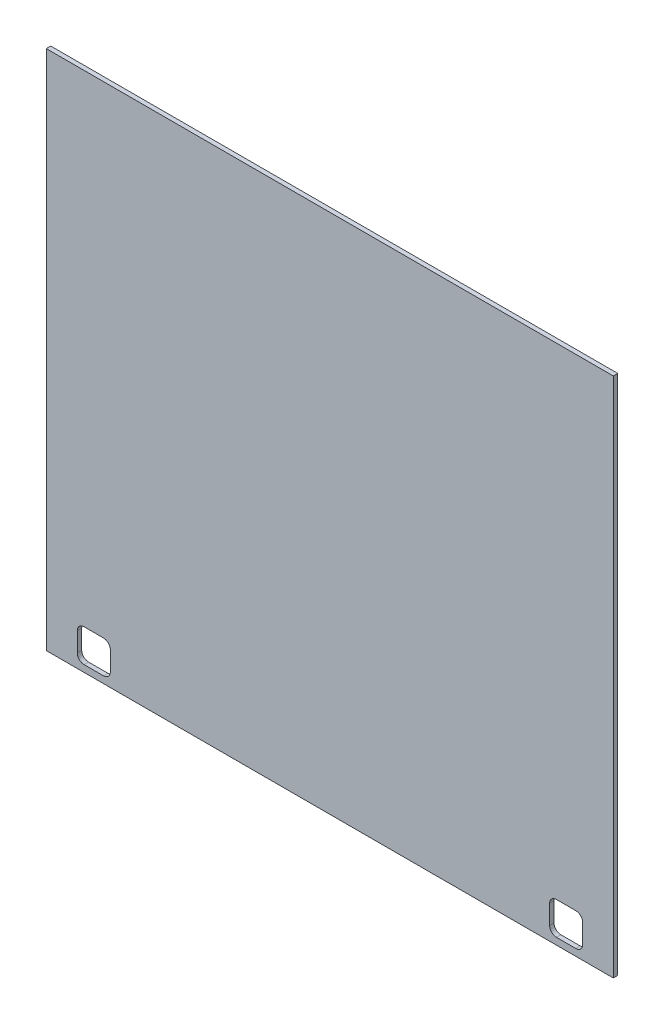
ISO-10303-21;
HEADER;
FILE_DESCRIPTION(('STEP AP214'),'2;1');
FILE_NAME('part.step','',(''),(''),'','','');
FILE_SCHEMA(('AUTOMOTIVE_DESIGN { 1 0 10303 214 1 1 1 1 }'));
ENDSEC;
DATA;
#1=APPLICATION_CONTEXT('core data for automotive mechanical design processes');
#2=APPLICATION_PROTOCOL_DEFINITION('international standard','automotive_design',2000,#1);
#3=PRODUCT_CONTEXT('',#1,'mechanical');
#4=PRODUCT('Part','Part','',(#3));
#5=PRODUCT_RELATED_PRODUCT_CATEGORY('part','',(#4));
#6=PRODUCT_DEFINITION_FORMATION('','',#4);
#7=PRODUCT_DEFINITION_CONTEXT('part definition',#1,'design');
#8=PRODUCT_DEFINITION('design','',#6,#7);
#9=PRODUCT_DEFINITION_SHAPE('','',#8);
#10=(LENGTH_UNIT() NAMED_UNIT(*) SI_UNIT(.MILLI.,.METRE.));
#11=(NAMED_UNIT(*) PLANE_ANGLE_UNIT() SI_UNIT($,.RADIAN.));
#12=(NAMED_UNIT(*) SI_UNIT($,.STERADIAN.) SOLID_ANGLE_UNIT());
#13=UNCERTAINTY_MEASURE_WITH_UNIT(LENGTH_MEASURE(1.E-05),#10,'distance_accuracy_value','');
#14=(GEOMETRIC_REPRESENTATION_CONTEXT(3) GLOBAL_UNCERTAINTY_ASSIGNED_CONTEXT((#13)) GLOBAL_UNIT_ASSIGNED_CONTEXT((#10,
#11,#12)) REPRESENTATION_CONTEXT('',''));
#15=CARTESIAN_POINT('',(0.,0.,0.));
#16=DIRECTION('',(0.,0.,1.));
#17=DIRECTION('',(1.,0.,0.));
#18=AXIS2_PLACEMENT_3D('',#15,#16,#17);
#19=CARTESIAN_POINT('',(416.,-382.5,6.5));
#20=DIRECTION('',(-1.,0.,0.));
#21=DIRECTION('',(0.,0.,1.));
#22=AXIS2_PLACEMENT_3D('',#19,#20,#21);
#23=PLANE('',#22);
#24=DIRECTION('',(0.,1.,0.));
#25=VECTOR('',#24,1.);
#26=CARTESIAN_POINT('',(416.,-382.5,0.));
#27=LINE('',#26,#25);
#28=CARTESIAN_POINT('',(416.,-382.5,0.));
#29=VERTEX_POINT('',#28);
#30=CARTESIAN_POINT('',(416.,382.5,0.));
#31=VERTEX_POINT('',#30);
#32=EDGE_CURVE('E287',#29,#31,#27,.T.);
#33=ORIENTED_EDGE('',*,*,#32,.T.);
#34=DIRECTION('',(0.,0.,-1.));
#35=VECTOR('',#34,1.);
#36=CARTESIAN_POINT('',(416.,382.5,6.5));
#37=LINE('',#36,#35);
#38=CARTESIAN_POINT('',(416.,382.5,6.5));
#39=VERTEX_POINT('',#38);
#40=EDGE_CURVE('E11',#39,#31,#37,.T.);
#41=ORIENTED_EDGE('',*,*,#40,.F.);
#42=DIRECTION('',(0.,1.,0.));
#43=VECTOR('',#42,1.);
#44=CARTESIAN_POINT('',(416.,-382.5,6.5));
#45=LINE('',#44,#43);
#46=CARTESIAN_POINT('',(416.,-382.5,6.5));
#47=VERTEX_POINT('',#46);
#48=EDGE_CURVE('E302',#47,#39,#45,.T.);
#49=ORIENTED_EDGE('',*,*,#48,.F.);
#50=DIRECTION('',(0.,0.,-1.));
#51=VECTOR('',#50,1.);
#52=CARTESIAN_POINT('',(416.,-382.5,6.5));
#53=LINE('',#52,#51);
#54=EDGE_CURVE('E312',#47,#29,#53,.T.);
#55=ORIENTED_EDGE('',*,*,#54,.T.);
#56=EDGE_LOOP('',(#33,#41,#49,#55));
#57=FACE_BOUND('',#56,.T.);
#58=ADVANCED_FACE('F33',(#57),#23,.F.);
#59=CARTESIAN_POINT('',(-416.,382.5,6.5));
#60=DIRECTION('',(0.,-1.,0.));
#61=DIRECTION('',(0.,0.,-1.));
#62=AXIS2_PLACEMENT_3D('',#59,#60,#61);
#63=PLANE('',#62);
#64=DIRECTION('',(-1.,0.,0.));
#65=VECTOR('',#64,1.);
#66=CARTESIAN_POINT('',(-416.,382.5,0.));
#67=LINE('',#66,#65);
#68=CARTESIAN_POINT('',(-416.,382.5,0.));
#69=VERTEX_POINT('',#68);
#70=EDGE_CURVE('E315',#31,#69,#67,.T.);
#71=ORIENTED_EDGE('',*,*,#70,.T.);
#72=DIRECTION('',(0.,0.,-1.));
#73=VECTOR('',#72,1.);
#74=CARTESIAN_POINT('',(-416.,382.5,6.5));
#75=LINE('',#74,#73);
#76=CARTESIAN_POINT('',(-416.,382.5,6.5));
#77=VERTEX_POINT('',#76);
#78=EDGE_CURVE('E40',#77,#69,#75,.T.);
#79=ORIENTED_EDGE('',*,*,#78,.F.);
#80=DIRECTION('',(-1.,0.,0.));
#81=VECTOR('',#80,1.);
#82=CARTESIAN_POINT('',(-416.,382.5,6.5));
#83=LINE('',#82,#81);
#84=EDGE_CURVE('E305',#39,#77,#83,.T.);
#85=ORIENTED_EDGE('',*,*,#84,.F.);
#86=ORIENTED_EDGE('',*,*,#40,.T.);
#87=EDGE_LOOP('',(#71,#79,#85,#86));
#88=FACE_BOUND('',#87,.T.);
#89=ADVANCED_FACE('F344',(#88),#63,.F.);
#90=CARTESIAN_POINT('',(-416.,-382.5,6.5));
#91=DIRECTION('',(1.,0.,0.));
#92=DIRECTION('',(0.,0.,-1.));
#93=AXIS2_PLACEMENT_3D('',#90,#91,#92);
#94=PLANE('',#93);
#95=DIRECTION('',(0.,-1.,0.));
#96=VECTOR('',#95,1.);
#97=CARTESIAN_POINT('',(-416.,-382.5,0.));
#98=LINE('',#97,#96);
#99=CARTESIAN_POINT('',(-416.,-382.5,0.));
#100=VERTEX_POINT('',#99);
#101=EDGE_CURVE('E317',#69,#100,#98,.T.);
#102=ORIENTED_EDGE('',*,*,#101,.T.);
#103=DIRECTION('',(0.,0.,-1.));
#104=VECTOR('',#103,1.);
#105=CARTESIAN_POINT('',(-416.,-382.5,6.5));
#106=LINE('',#105,#104);
#107=CARTESIAN_POINT('',(-416.,-382.5,6.5));
#108=VERTEX_POINT('',#107);
#109=EDGE_CURVE('E322',#108,#100,#106,.T.);
#110=ORIENTED_EDGE('',*,*,#109,.F.);
#111=DIRECTION('',(0.,-1.,0.));
#112=VECTOR('',#111,1.);
#113=CARTESIAN_POINT('',(-416.,-382.5,6.5));
#114=LINE('',#113,#112);
#115=EDGE_CURVE('E308',#77,#108,#114,.T.);
#116=ORIENTED_EDGE('',*,*,#115,.F.);
#117=ORIENTED_EDGE('',*,*,#78,.T.);
#118=EDGE_LOOP('',(#102,#110,#116,#117));
#119=FACE_BOUND('',#118,.T.);
#120=ADVANCED_FACE('F329',(#119),#94,.F.);
#121=CARTESIAN_POINT('',(-416.,-382.5,6.5));
#122=DIRECTION('',(0.,1.,0.));
#123=DIRECTION('',(0.,0.,1.));
#124=AXIS2_PLACEMENT_3D('',#121,#122,#123);
#125=PLANE('',#124);
#126=DIRECTION('',(1.,0.,0.));
#127=VECTOR('',#126,1.);
#128=CARTESIAN_POINT('',(-416.,-382.5,0.));
#129=LINE('',#128,#127);
#130=EDGE_CURVE('E306',#100,#29,#129,.T.);
#131=ORIENTED_EDGE('',*,*,#130,.T.);
#132=ORIENTED_EDGE('',*,*,#54,.F.);
#133=DIRECTION('',(1.,0.,0.));
#134=VECTOR('',#133,1.);
#135=CARTESIAN_POINT('',(-416.,-382.5,6.5));
#136=LINE('',#135,#134);
#137=EDGE_CURVE('E310',#108,#47,#136,.T.);
#138=ORIENTED_EDGE('',*,*,#137,.F.);
#139=ORIENTED_EDGE('',*,*,#109,.T.);
#140=EDGE_LOOP('',(#131,#132,#138,#139));
#141=FACE_BOUND('',#140,.T.);
#142=ADVANCED_FACE('F338',(#141),#125,.F.);
#143=CARTESIAN_POINT('',(0.,0.,6.5));
#144=DIRECTION('',(0.,0.,-1.));
#145=DIRECTION('',(-1.,0.,0.));
#146=AXIS2_PLACEMENT_3D('',#143,#144,#145);
#147=PLANE('',#146);
#148=DIRECTION('',(-1.,0.,0.));
#149=VECTOR('',#148,1.);
#150=CARTESIAN_POINT('',(-332.,-372.521350196704,6.5));
#151=LINE('',#150,#149);
#152=CARTESIAN_POINT('',(-332.,-372.521350196704,6.5));
#153=VERTEX_POINT('',#152);
#154=CARTESIAN_POINT('',(-360.473976839619,-372.521350196704,6.5));
#155=VERTEX_POINT('',#154);
#156=EDGE_CURVE('E177',#153,#155,#151,.T.);
#157=ORIENTED_EDGE('',*,*,#156,.T.);
#158=CARTESIAN_POINT('',(-360.473976839619,-362.521350196704,6.5));
#159=DIRECTION('',(0.,0.,-1.));
#160=DIRECTION('',(1.,0.,0.));
#161=AXIS2_PLACEMENT_3D('',#158,#159,#160);
#162=CIRCLE('',#161,10.);
#163=CARTESIAN_POINT('',(-370.473976839619,-362.521350196704,6.5));
#164=VERTEX_POINT('',#163);
#165=EDGE_CURVE('E171',#155,#164,#162,.T.);
#166=ORIENTED_EDGE('',*,*,#165,.T.);
#167=DIRECTION('',(0.,1.,0.));
#168=VECTOR('',#167,1.);
#169=CARTESIAN_POINT('',(-370.473976839619,-362.521350196704,6.5));
#170=LINE('',#169,#168);
#171=CARTESIAN_POINT('',(-370.473976839619,-334.475228476118,6.5));
#172=VERTEX_POINT('',#171);
#173=EDGE_CURVE('E180',#164,#172,#170,.T.);
#174=ORIENTED_EDGE('',*,*,#173,.T.);
#175=CARTESIAN_POINT('',(-360.473976839619,-334.475228476118,6.5));
#176=DIRECTION('',(0.,0.,-1.));
#177=DIRECTION('',(-1.,0.,0.));
#178=AXIS2_PLACEMENT_3D('',#175,#176,#177);
#179=CIRCLE('',#178,9.99999999999998);
#180=CARTESIAN_POINT('',(-360.473976839619,-324.475228476118,6.5));
#181=VERTEX_POINT('',#180);
#182=EDGE_CURVE('E47',#172,#181,#179,.T.);
#183=ORIENTED_EDGE('',*,*,#182,.T.);
#184=DIRECTION('',(1.,0.,0.));
#185=VECTOR('',#184,1.);
#186=CARTESIAN_POINT('',(-332.,-324.475228476118,6.5));
#187=LINE('',#186,#185);
#188=CARTESIAN_POINT('',(-332.,-324.475228476118,6.5));
#189=VERTEX_POINT('',#188);
#190=EDGE_CURVE('E195',#181,#189,#187,.T.);
#191=ORIENTED_EDGE('',*,*,#190,.T.);
#192=CARTESIAN_POINT('',(-332.,-334.475228476118,6.5));
#193=DIRECTION('',(0.,0.,-1.));
#194=DIRECTION('',(1.,0.,0.));
#195=AXIS2_PLACEMENT_3D('',#192,#193,#194);
#196=CIRCLE('',#195,10.);
#197=CARTESIAN_POINT('',(-322.,-334.475228476118,6.5));
#198=VERTEX_POINT('',#197);
#199=EDGE_CURVE('E198',#189,#198,#196,.T.);
#200=ORIENTED_EDGE('',*,*,#199,.T.);
#201=DIRECTION('',(0.,-1.,0.));
#202=VECTOR('',#201,1.);
#203=CARTESIAN_POINT('',(-322.,-362.521350196704,6.5));
#204=LINE('',#203,#202);
#205=CARTESIAN_POINT('',(-322.,-362.521350196704,6.5));
#206=VERTEX_POINT('',#205);
#207=EDGE_CURVE('E201',#198,#206,#204,.T.);
#208=ORIENTED_EDGE('',*,*,#207,.T.);
#209=CARTESIAN_POINT('',(-332.,-362.521350196704,6.5));
#210=DIRECTION('',(0.,0.,-1.));
#211=DIRECTION('',(1.,0.,0.));
#212=AXIS2_PLACEMENT_3D('',#209,#210,#211);
#213=CIRCLE('',#212,10.);
#214=EDGE_CURVE('E204',#206,#153,#213,.T.);
#215=ORIENTED_EDGE('',*,*,#214,.T.);
#216=EDGE_LOOP('',(#157,#166,#174,#183,#191,#200,#208,#215));
#217=FACE_BOUND('',#216,.T.);
#218=DIRECTION('',(-1.,0.,0.));
#219=VECTOR('',#218,1.);
#220=CARTESIAN_POINT('',(361.,-372.521350196704,6.5));
#221=LINE('',#220,#219);
#222=CARTESIAN_POINT('',(361.,-372.521350196704,6.5));
#223=VERTEX_POINT('',#222);
#224=CARTESIAN_POINT('',(332.526023160381,-372.521350196704,6.5));
#225=VERTEX_POINT('',#224);
#226=EDGE_CURVE('E260',#223,#225,#221,.T.);
#227=ORIENTED_EDGE('',*,*,#226,.T.);
#228=CARTESIAN_POINT('',(332.526023160381,-362.521350196704,6.5));
#229=DIRECTION('',(0.,0.,-1.));
#230=DIRECTION('',(1.,0.,0.));
#231=AXIS2_PLACEMENT_3D('',#228,#229,#230);
#232=CIRCLE('',#231,10.);
#233=CARTESIAN_POINT('',(322.526023160381,-362.521350196704,6.5));
#234=VERTEX_POINT('',#233);
#235=EDGE_CURVE('E238',#225,#234,#232,.T.);
#236=ORIENTED_EDGE('',*,*,#235,.T.);
#237=DIRECTION('',(0.,1.,0.));
#238=VECTOR('',#237,1.);
#239=CARTESIAN_POINT('',(322.526023160381,-362.521350196704,6.5));
#240=LINE('',#239,#238);
#241=CARTESIAN_POINT('',(322.526023160381,-334.475228476118,6.5));
#242=VERTEX_POINT('',#241);
#243=EDGE_CURVE('E241',#234,#242,#240,.T.);
#244=ORIENTED_EDGE('',*,*,#243,.T.);
#245=CARTESIAN_POINT('',(332.526023160381,-334.475228476118,6.5));
#246=DIRECTION('',(0.,0.,-1.));
#247=DIRECTION('',(-1.,0.,0.));
#248=AXIS2_PLACEMENT_3D('',#245,#246,#247);
#249=CIRCLE('',#248,9.99999999999998);
#250=CARTESIAN_POINT('',(332.526023160381,-324.475228476118,6.5));
#251=VERTEX_POINT('',#250);
#252=EDGE_CURVE('E245',#242,#251,#249,.T.);
#253=ORIENTED_EDGE('',*,*,#252,.T.);
#254=DIRECTION('',(1.,0.,0.));
#255=VECTOR('',#254,1.);
#256=CARTESIAN_POINT('',(361.,-324.475228476118,6.5));
#257=LINE('',#256,#255);
#258=CARTESIAN_POINT('',(361.,-324.475228476118,6.5));
#259=VERTEX_POINT('',#258);
#260=EDGE_CURVE('E248',#251,#259,#257,.T.);
#261=ORIENTED_EDGE('',*,*,#260,.T.);
#262=CARTESIAN_POINT('',(361.,-334.475228476118,6.5));
#263=DIRECTION('',(0.,0.,-1.));
#264=DIRECTION('',(1.,0.,0.));
#265=AXIS2_PLACEMENT_3D('',#262,#263,#264);
#266=CIRCLE('',#265,10.);
#267=CARTESIAN_POINT('',(371.,-334.475228476118,6.5));
#268=VERTEX_POINT('',#267);
#269=EDGE_CURVE('E251',#259,#268,#266,.T.);
#270=ORIENTED_EDGE('',*,*,#269,.T.);
#271=DIRECTION('',(0.,-1.,0.));
#272=VECTOR('',#271,1.);
#273=CARTESIAN_POINT('',(371.,-362.521350196704,6.5));
#274=LINE('',#273,#272);
#275=CARTESIAN_POINT('',(371.,-362.521350196704,6.5));
#276=VERTEX_POINT('',#275);
#277=EDGE_CURVE('E254',#268,#276,#274,.T.);
#278=ORIENTED_EDGE('',*,*,#277,.T.);
#279=CARTESIAN_POINT('',(361.,-362.521350196704,6.5));
#280=DIRECTION('',(0.,0.,-1.));
#281=DIRECTION('',(1.,0.,0.));
#282=AXIS2_PLACEMENT_3D('',#279,#280,#281);
#283=CIRCLE('',#282,10.);
#284=EDGE_CURVE('E257',#276,#223,#283,.T.);
#285=ORIENTED_EDGE('',*,*,#284,.T.);
#286=EDGE_LOOP('',(#227,#236,#244,#253,#261,#270,#278,#285));
#287=FACE_BOUND('',#286,.T.);
#288=ORIENTED_EDGE('',*,*,#48,.T.);
#289=ORIENTED_EDGE('',*,*,#84,.T.);
#290=ORIENTED_EDGE('',*,*,#115,.T.);
#291=ORIENTED_EDGE('',*,*,#137,.T.);
#292=EDGE_LOOP('',(#288,#289,#290,#291));
#293=FACE_BOUND('',#292,.T.);
#294=ADVANCED_FACE('F184',(#217,#287,#293),#147,.F.);
#295=CARTESIAN_POINT('',(0.,0.,0.));
#296=DIRECTION('',(0.,0.,-1.));
#297=DIRECTION('',(-1.,0.,0.));
#298=AXIS2_PLACEMENT_3D('',#295,#296,#297);
#299=PLANE('',#298);
#300=CARTESIAN_POINT('',(-360.473976839619,-362.521350196704,0.));
#301=DIRECTION('',(0.,0.,-1.));
#302=DIRECTION('',(1.,0.,0.));
#303=AXIS2_PLACEMENT_3D('',#300,#301,#302);
#304=CIRCLE('',#303,10.);
#305=CARTESIAN_POINT('',(-360.473976839619,-372.521350196704,0.));
#306=VERTEX_POINT('',#305);
#307=CARTESIAN_POINT('',(-370.473976839619,-362.521350196704,0.));
#308=VERTEX_POINT('',#307);
#309=EDGE_CURVE('E55',#306,#308,#304,.T.);
#310=ORIENTED_EDGE('',*,*,#309,.F.);
#311=DIRECTION('',(-1.,0.,0.));
#312=VECTOR('',#311,1.);
#313=CARTESIAN_POINT('',(-332.,-372.521350196704,0.));
#314=LINE('',#313,#312);
#315=CARTESIAN_POINT('',(-332.,-372.521350196704,0.));
#316=VERTEX_POINT('',#315);
#317=EDGE_CURVE('E188',#316,#306,#314,.T.);
#318=ORIENTED_EDGE('',*,*,#317,.F.);
#319=CARTESIAN_POINT('',(-332.,-362.521350196704,0.));
#320=DIRECTION('',(0.,0.,-1.));
#321=DIRECTION('',(1.,0.,0.));
#322=AXIS2_PLACEMENT_3D('',#319,#320,#321);
#323=CIRCLE('',#322,10.);
#324=CARTESIAN_POINT('',(-322.,-362.521350196704,0.));
#325=VERTEX_POINT('',#324);
#326=EDGE_CURVE('E191',#325,#316,#323,.T.);
#327=ORIENTED_EDGE('',*,*,#326,.F.);
#328=DIRECTION('',(0.,-1.,0.));
#329=VECTOR('',#328,1.);
#330=CARTESIAN_POINT('',(-322.,-362.521350196704,0.));
#331=LINE('',#330,#329);
#332=CARTESIAN_POINT('',(-322.,-334.475228476118,0.));
#333=VERTEX_POINT('',#332);
#334=EDGE_CURVE('E219',#333,#325,#331,.T.);
#335=ORIENTED_EDGE('',*,*,#334,.F.);
#336=CARTESIAN_POINT('',(-332.,-334.475228476118,0.));
#337=DIRECTION('',(0.,0.,-1.));
#338=DIRECTION('',(1.,0.,0.));
#339=AXIS2_PLACEMENT_3D('',#336,#337,#338);
#340=CIRCLE('',#339,10.);
#341=CARTESIAN_POINT('',(-332.,-324.475228476118,0.));
#342=VERTEX_POINT('',#341);
#343=EDGE_CURVE('E216',#342,#333,#340,.T.);
#344=ORIENTED_EDGE('',*,*,#343,.F.);
#345=DIRECTION('',(1.,0.,0.));
#346=VECTOR('',#345,1.);
#347=CARTESIAN_POINT('',(-332.,-324.475228476118,0.));
#348=LINE('',#347,#346);
#349=CARTESIAN_POINT('',(-360.473976839619,-324.475228476118,0.));
#350=VERTEX_POINT('',#349);
#351=EDGE_CURVE('E213',#350,#342,#348,.T.);
#352=ORIENTED_EDGE('',*,*,#351,.F.);
#353=CARTESIAN_POINT('',(-360.473976839619,-334.475228476118,0.));
#354=DIRECTION('',(0.,0.,-1.));
#355=DIRECTION('',(-1.,0.,0.));
#356=AXIS2_PLACEMENT_3D('',#353,#354,#355);
#357=CIRCLE('',#356,9.99999999999998);
#358=CARTESIAN_POINT('',(-370.473976839619,-334.475228476118,0.));
#359=VERTEX_POINT('',#358);
#360=EDGE_CURVE('E210',#359,#350,#357,.T.);
#361=ORIENTED_EDGE('',*,*,#360,.F.);
#362=DIRECTION('',(0.,1.,0.));
#363=VECTOR('',#362,1.);
#364=CARTESIAN_POINT('',(-370.473976839619,-362.521350196704,0.));
#365=LINE('',#364,#363);
#366=EDGE_CURVE('E208',#308,#359,#365,.T.);
#367=ORIENTED_EDGE('',*,*,#366,.F.);
#368=EDGE_LOOP('',(#310,#318,#327,#335,#344,#352,#361,#367));
#369=FACE_BOUND('',#368,.T.);
#370=CARTESIAN_POINT('',(332.526023160381,-362.521350196704,0.));
#371=DIRECTION('',(0.,0.,-1.));
#372=DIRECTION('',(1.,0.,0.));
#373=AXIS2_PLACEMENT_3D('',#370,#371,#372);
#374=CIRCLE('',#373,10.);
#375=CARTESIAN_POINT('',(332.526023160381,-372.521350196704,0.));
#376=VERTEX_POINT('',#375);
#377=CARTESIAN_POINT('',(322.526023160381,-362.521350196704,0.));
#378=VERTEX_POINT('',#377);
#379=EDGE_CURVE('E226',#376,#378,#374,.T.);
#380=ORIENTED_EDGE('',*,*,#379,.F.);
#381=DIRECTION('',(-1.,0.,0.));
#382=VECTOR('',#381,1.);
#383=CARTESIAN_POINT('',(361.,-372.521350196704,0.));
#384=LINE('',#383,#382);
#385=CARTESIAN_POINT('',(361.,-372.521350196704,0.));
#386=VERTEX_POINT('',#385);
#387=EDGE_CURVE('E242',#386,#376,#384,.T.);
#388=ORIENTED_EDGE('',*,*,#387,.F.);
#389=CARTESIAN_POINT('',(361.,-362.521350196704,0.));
#390=DIRECTION('',(0.,0.,-1.));
#391=DIRECTION('',(1.,0.,0.));
#392=AXIS2_PLACEMENT_3D('',#389,#390,#391);
#393=CIRCLE('',#392,10.);
#394=CARTESIAN_POINT('',(371.,-362.521350196704,0.));
#395=VERTEX_POINT('',#394);
#396=EDGE_CURVE('E280',#395,#386,#393,.T.);
#397=ORIENTED_EDGE('',*,*,#396,.F.);
#398=DIRECTION('',(0.,-1.,0.));
#399=VECTOR('',#398,1.);
#400=CARTESIAN_POINT('',(371.,-362.521350196704,0.));
#401=LINE('',#400,#399);
#402=CARTESIAN_POINT('',(371.,-334.475228476118,0.));
#403=VERTEX_POINT('',#402);
#404=EDGE_CURVE('E277',#403,#395,#401,.T.);
#405=ORIENTED_EDGE('',*,*,#404,.F.);
#406=CARTESIAN_POINT('',(361.,-334.475228476118,0.));
#407=DIRECTION('',(0.,0.,-1.));
#408=DIRECTION('',(1.,0.,0.));
#409=AXIS2_PLACEMENT_3D('',#406,#407,#408);
#410=CIRCLE('',#409,10.);
#411=CARTESIAN_POINT('',(361.,-324.475228476118,0.));
#412=VERTEX_POINT('',#411);
#413=EDGE_CURVE('E274',#412,#403,#410,.T.);
#414=ORIENTED_EDGE('',*,*,#413,.F.);
#415=DIRECTION('',(1.,0.,0.));
#416=VECTOR('',#415,1.);
#417=CARTESIAN_POINT('',(361.,-324.475228476118,0.));
#418=LINE('',#417,#416);
#419=CARTESIAN_POINT('',(332.526023160381,-324.475228476118,0.));
#420=VERTEX_POINT('',#419);
#421=EDGE_CURVE('E271',#420,#412,#418,.T.);
#422=ORIENTED_EDGE('',*,*,#421,.F.);
#423=CARTESIAN_POINT('',(332.526023160381,-334.475228476118,0.));
#424=DIRECTION('',(0.,0.,-1.));
#425=DIRECTION('',(-1.,0.,0.));
#426=AXIS2_PLACEMENT_3D('',#423,#424,#425);
#427=CIRCLE('',#426,9.99999999999998);
#428=CARTESIAN_POINT('',(322.526023160381,-334.475228476118,0.));
#429=VERTEX_POINT('',#428);
#430=EDGE_CURVE('E268',#429,#420,#427,.T.);
#431=ORIENTED_EDGE('',*,*,#430,.F.);
#432=DIRECTION('',(0.,1.,0.));
#433=VECTOR('',#432,1.);
#434=CARTESIAN_POINT('',(322.526023160381,-362.521350196704,0.));
#435=LINE('',#434,#433);
#436=EDGE_CURVE('E265',#378,#429,#435,.T.);
#437=ORIENTED_EDGE('',*,*,#436,.F.);
#438=EDGE_LOOP('',(#380,#388,#397,#405,#414,#422,#431,#437));
#439=FACE_BOUND('',#438,.T.);
#440=ORIENTED_EDGE('',*,*,#32,.F.);
#441=ORIENTED_EDGE('',*,*,#130,.F.);
#442=ORIENTED_EDGE('',*,*,#101,.F.);
#443=ORIENTED_EDGE('',*,*,#70,.F.);
#444=EDGE_LOOP('',(#440,#441,#442,#443));
#445=FACE_BOUND('',#444,.T.);
#446=ADVANCED_FACE('F335',(#369,#439,#445),#299,.T.);
#447=CARTESIAN_POINT('',(332.526023160381,-362.521350196704,6.5));
#448=DIRECTION('',(0.,0.,-1.));
#449=DIRECTION('',(-1.,0.,0.));
#450=AXIS2_PLACEMENT_3D('',#447,#448,#449);
#451=CYLINDRICAL_SURFACE('',#450,10.);
#452=ORIENTED_EDGE('',*,*,#379,.T.);
#453=DIRECTION('',(0.,0.,-1.));
#454=VECTOR('',#453,1.);
#455=CARTESIAN_POINT('',(322.526023160381,-362.521350196704,6.5));
#456=LINE('',#455,#454);
#457=EDGE_CURVE('E263',#234,#378,#456,.T.);
#458=ORIENTED_EDGE('',*,*,#457,.F.);
#459=ORIENTED_EDGE('',*,*,#235,.F.);
#460=DIRECTION('',(0.,0.,-1.));
#461=VECTOR('',#460,1.);
#462=CARTESIAN_POINT('',(332.526023160381,-372.521350196704,6.5));
#463=LINE('',#462,#461);
#464=EDGE_CURVE('E285',#225,#376,#463,.T.);
#465=ORIENTED_EDGE('',*,*,#464,.T.);
#466=EDGE_LOOP('',(#452,#458,#459,#465));
#467=FACE_BOUND('',#466,.T.);
#468=ADVANCED_FACE('F356',(#467),#451,.F.);
#469=CARTESIAN_POINT('',(361.,-372.521350196704,6.5));
#470=DIRECTION('',(0.,-1.,0.));
#471=DIRECTION('',(1.,0.,0.));
#472=AXIS2_PLACEMENT_3D('',#469,#470,#471);
#473=PLANE('',#472);
#474=ORIENTED_EDGE('',*,*,#387,.T.);
#475=ORIENTED_EDGE('',*,*,#464,.F.);
#476=ORIENTED_EDGE('',*,*,#226,.F.);
#477=DIRECTION('',(0.,0.,-1.));
#478=VECTOR('',#477,1.);
#479=CARTESIAN_POINT('',(361.,-372.521350196704,6.5));
#480=LINE('',#479,#478);
#481=EDGE_CURVE('E288',#223,#386,#480,.T.);
#482=ORIENTED_EDGE('',*,*,#481,.T.);
#483=EDGE_LOOP('',(#474,#475,#476,#482));
#484=FACE_BOUND('',#483,.T.);
#485=ADVANCED_FACE('F362',(#484),#473,.F.);
#486=CARTESIAN_POINT('',(361.,-362.521350196704,6.5));
#487=DIRECTION('',(0.,0.,-1.));
#488=DIRECTION('',(-1.,0.,0.));
#489=AXIS2_PLACEMENT_3D('',#486,#487,#488);
#490=CYLINDRICAL_SURFACE('',#489,10.);
#491=ORIENTED_EDGE('',*,*,#396,.T.);
#492=ORIENTED_EDGE('',*,*,#481,.F.);
#493=ORIENTED_EDGE('',*,*,#284,.F.);
#494=DIRECTION('',(0.,0.,-1.));
#495=VECTOR('',#494,1.);
#496=CARTESIAN_POINT('',(371.,-362.521350196704,6.5));
#497=LINE('',#496,#495);
#498=EDGE_CURVE('E290',#276,#395,#497,.T.);
#499=ORIENTED_EDGE('',*,*,#498,.T.);
#500=EDGE_LOOP('',(#491,#492,#493,#499));
#501=FACE_BOUND('',#500,.T.);
#502=ADVANCED_FACE('F383',(#501),#490,.F.);
#503=CARTESIAN_POINT('',(371.,-362.521350196704,6.5));
#504=DIRECTION('',(1.,0.,0.));
#505=DIRECTION('',(0.,0.,-1.));
#506=AXIS2_PLACEMENT_3D('',#503,#504,#505);
#507=PLANE('',#506);
#508=ORIENTED_EDGE('',*,*,#404,.T.);
#509=ORIENTED_EDGE('',*,*,#498,.F.);
#510=ORIENTED_EDGE('',*,*,#277,.F.);
#511=DIRECTION('',(0.,0.,-1.));
#512=VECTOR('',#511,1.);
#513=CARTESIAN_POINT('',(371.,-334.475228476118,6.5));
#514=LINE('',#513,#512);
#515=EDGE_CURVE('E292',#268,#403,#514,.T.);
#516=ORIENTED_EDGE('',*,*,#515,.T.);
#517=EDGE_LOOP('',(#508,#509,#510,#516));
#518=FACE_BOUND('',#517,.T.);
#519=ADVANCED_FACE('F379',(#518),#507,.F.);
#520=CARTESIAN_POINT('',(361.,-334.475228476118,6.5));
#521=DIRECTION('',(0.,0.,-1.));
#522=DIRECTION('',(-1.,0.,0.));
#523=AXIS2_PLACEMENT_3D('',#520,#521,#522);
#524=CYLINDRICAL_SURFACE('',#523,10.);
#525=ORIENTED_EDGE('',*,*,#413,.T.);
#526=ORIENTED_EDGE('',*,*,#515,.F.);
#527=ORIENTED_EDGE('',*,*,#269,.F.);
#528=DIRECTION('',(0.,0.,-1.));
#529=VECTOR('',#528,1.);
#530=CARTESIAN_POINT('',(361.,-324.475228476118,6.5));
#531=LINE('',#530,#529);
#532=EDGE_CURVE('E294',#259,#412,#531,.T.);
#533=ORIENTED_EDGE('',*,*,#532,.T.);
#534=EDGE_LOOP('',(#525,#526,#527,#533));
#535=FACE_BOUND('',#534,.T.);
#536=ADVANCED_FACE('F375',(#535),#524,.F.);
#537=CARTESIAN_POINT('',(361.,-324.475228476118,6.5));
#538=DIRECTION('',(0.,1.,0.));
#539=DIRECTION('',(0.,0.,1.));
#540=AXIS2_PLACEMENT_3D('',#537,#538,#539);
#541=PLANE('',#540);
#542=ORIENTED_EDGE('',*,*,#421,.T.);
#543=ORIENTED_EDGE('',*,*,#532,.F.);
#544=ORIENTED_EDGE('',*,*,#260,.F.);
#545=DIRECTION('',(0.,0.,-1.));
#546=VECTOR('',#545,1.);
#547=CARTESIAN_POINT('',(332.526023160381,-324.475228476118,6.5));
#548=LINE('',#547,#546);
#549=EDGE_CURVE('E296',#251,#420,#548,.T.);
#550=ORIENTED_EDGE('',*,*,#549,.T.);
#551=EDGE_LOOP('',(#542,#543,#544,#550));
#552=FACE_BOUND('',#551,.T.);
#553=ADVANCED_FACE('F371',(#552),#541,.F.);
#554=CARTESIAN_POINT('',(332.526023160381,-334.475228476118,6.5));
#555=DIRECTION('',(0.,0.,-1.));
#556=DIRECTION('',(-1.,0.,0.));
#557=AXIS2_PLACEMENT_3D('',#554,#555,#556);
#558=CYLINDRICAL_SURFACE('',#557,9.99999999999998);
#559=ORIENTED_EDGE('',*,*,#430,.T.);
#560=ORIENTED_EDGE('',*,*,#549,.F.);
#561=ORIENTED_EDGE('',*,*,#252,.F.);
#562=DIRECTION('',(0.,0.,-1.));
#563=VECTOR('',#562,1.);
#564=CARTESIAN_POINT('',(322.526023160381,-334.475228476118,6.5));
#565=LINE('',#564,#563);
#566=EDGE_CURVE('E298',#242,#429,#565,.T.);
#567=ORIENTED_EDGE('',*,*,#566,.T.);
#568=EDGE_LOOP('',(#559,#560,#561,#567));
#569=FACE_BOUND('',#568,.T.);
#570=ADVANCED_FACE('F367',(#569),#558,.F.);
#571=CARTESIAN_POINT('',(322.526023160381,-362.521350196704,6.5));
#572=DIRECTION('',(-1.,0.,0.));
#573=DIRECTION('',(0.,0.,1.));
#574=AXIS2_PLACEMENT_3D('',#571,#572,#573);
#575=PLANE('',#574);
#576=ORIENTED_EDGE('',*,*,#436,.T.);
#577=ORIENTED_EDGE('',*,*,#566,.F.);
#578=ORIENTED_EDGE('',*,*,#243,.F.);
#579=ORIENTED_EDGE('',*,*,#457,.T.);
#580=EDGE_LOOP('',(#576,#577,#578,#579));
#581=FACE_BOUND('',#580,.T.);
#582=ADVANCED_FACE('F364',(#581),#575,.F.);
#583=CARTESIAN_POINT('',(-360.473976839619,-362.521350196704,6.5));
#584=DIRECTION('',(0.,0.,-1.));
#585=DIRECTION('',(-1.,0.,0.));
#586=AXIS2_PLACEMENT_3D('',#583,#584,#585);
#587=CYLINDRICAL_SURFACE('',#586,10.);
#588=ORIENTED_EDGE('',*,*,#309,.T.);
#589=DIRECTION('',(0.,0.,-1.));
#590=VECTOR('',#589,1.);
#591=CARTESIAN_POINT('',(-370.473976839619,-362.521350196704,6.5));
#592=LINE('',#591,#590);
#593=EDGE_CURVE('E167',#164,#308,#592,.T.);
#594=ORIENTED_EDGE('',*,*,#593,.F.);
#595=ORIENTED_EDGE('',*,*,#165,.F.);
#596=DIRECTION('',(0.,0.,-1.));
#597=VECTOR('',#596,1.);
#598=CARTESIAN_POINT('',(-360.473976839619,-372.521350196704,6.5));
#599=LINE('',#598,#597);
#600=EDGE_CURVE('E224',#155,#306,#599,.T.);
#601=ORIENTED_EDGE('',*,*,#600,.T.);
#602=EDGE_LOOP('',(#588,#594,#595,#601));
#603=FACE_BOUND('',#602,.T.);
#604=ADVANCED_FACE('F169',(#603),#587,.F.);
#605=CARTESIAN_POINT('',(-332.,-372.521350196704,6.5));
#606=DIRECTION('',(0.,-1.,0.));
#607=DIRECTION('',(1.,0.,0.));
#608=AXIS2_PLACEMENT_3D('',#605,#606,#607);
#609=PLANE('',#608);
#610=ORIENTED_EDGE('',*,*,#317,.T.);
#611=ORIENTED_EDGE('',*,*,#600,.F.);
#612=ORIENTED_EDGE('',*,*,#156,.F.);
#613=DIRECTION('',(0.,0.,-1.));
#614=VECTOR('',#613,1.);
#615=CARTESIAN_POINT('',(-332.,-372.521350196704,6.5));
#616=LINE('',#615,#614);
#617=EDGE_CURVE('E227',#153,#316,#616,.T.);
#618=ORIENTED_EDGE('',*,*,#617,.T.);
#619=EDGE_LOOP('',(#610,#611,#612,#618));
#620=FACE_BOUND('',#619,.T.);
#621=ADVANCED_FACE('F393',(#620),#609,.F.);
#622=CARTESIAN_POINT('',(-332.,-362.521350196704,6.5));
#623=DIRECTION('',(0.,0.,-1.));
#624=DIRECTION('',(-1.,0.,0.));
#625=AXIS2_PLACEMENT_3D('',#622,#623,#624);
#626=CYLINDRICAL_SURFACE('',#625,10.);
#627=ORIENTED_EDGE('',*,*,#326,.T.);
#628=ORIENTED_EDGE('',*,*,#617,.F.);
#629=ORIENTED_EDGE('',*,*,#214,.F.);
#630=DIRECTION('',(0.,0.,-1.));
#631=VECTOR('',#630,1.);
#632=CARTESIAN_POINT('',(-322.,-362.521350196704,6.5));
#633=LINE('',#632,#631);
#634=EDGE_CURVE('E229',#206,#325,#633,.T.);
#635=ORIENTED_EDGE('',*,*,#634,.T.);
#636=EDGE_LOOP('',(#627,#628,#629,#635));
#637=FACE_BOUND('',#636,.T.);
#638=ADVANCED_FACE('F410',(#637),#626,.F.);
#639=CARTESIAN_POINT('',(-322.,-362.521350196704,6.5));
#640=DIRECTION('',(1.,0.,0.));
#641=DIRECTION('',(0.,0.,-1.));
#642=AXIS2_PLACEMENT_3D('',#639,#640,#641);
#643=PLANE('',#642);
#644=ORIENTED_EDGE('',*,*,#334,.T.);
#645=ORIENTED_EDGE('',*,*,#634,.F.);
#646=ORIENTED_EDGE('',*,*,#207,.F.);
#647=DIRECTION('',(0.,0.,-1.));
#648=VECTOR('',#647,1.);
#649=CARTESIAN_POINT('',(-322.,-334.475228476118,6.5));
#650=LINE('',#649,#648);
#651=EDGE_CURVE('E231',#198,#333,#650,.T.);
#652=ORIENTED_EDGE('',*,*,#651,.T.);
#653=EDGE_LOOP('',(#644,#645,#646,#652));
#654=FACE_BOUND('',#653,.T.);
#655=ADVANCED_FACE('F406',(#654),#643,.F.);
#656=CARTESIAN_POINT('',(-332.,-334.475228476118,6.5));
#657=DIRECTION('',(0.,0.,-1.));
#658=DIRECTION('',(-1.,0.,0.));
#659=AXIS2_PLACEMENT_3D('',#656,#657,#658);
#660=CYLINDRICAL_SURFACE('',#659,10.);
#661=ORIENTED_EDGE('',*,*,#343,.T.);
#662=ORIENTED_EDGE('',*,*,#651,.F.);
#663=ORIENTED_EDGE('',*,*,#199,.F.);
#664=DIRECTION('',(0.,0.,-1.));
#665=VECTOR('',#664,1.);
#666=CARTESIAN_POINT('',(-332.,-324.475228476118,6.5));
#667=LINE('',#666,#665);
#668=EDGE_CURVE('E233',#189,#342,#667,.T.);
#669=ORIENTED_EDGE('',*,*,#668,.T.);
#670=EDGE_LOOP('',(#661,#662,#663,#669));
#671=FACE_BOUND('',#670,.T.);
#672=ADVANCED_FACE('F402',(#671),#660,.F.);
#673=CARTESIAN_POINT('',(-332.,-324.475228476118,6.5));
#674=DIRECTION('',(0.,1.,0.));
#675=DIRECTION('',(0.,0.,1.));
#676=AXIS2_PLACEMENT_3D('',#673,#674,#675);
#677=PLANE('',#676);
#678=ORIENTED_EDGE('',*,*,#351,.T.);
#679=ORIENTED_EDGE('',*,*,#668,.F.);
#680=ORIENTED_EDGE('',*,*,#190,.F.);
#681=DIRECTION('',(0.,0.,-1.));
#682=VECTOR('',#681,1.);
#683=CARTESIAN_POINT('',(-360.473976839619,-324.475228476118,6.5));
#684=LINE('',#683,#682);
#685=EDGE_CURVE('E235',#181,#350,#684,.T.);
#686=ORIENTED_EDGE('',*,*,#685,.T.);
#687=EDGE_LOOP('',(#678,#679,#680,#686));
#688=FACE_BOUND('',#687,.T.);
#689=ADVANCED_FACE('F399',(#688),#677,.F.);
#690=CARTESIAN_POINT('',(-360.473976839619,-334.475228476118,6.5));
#691=DIRECTION('',(0.,0.,-1.));
#692=DIRECTION('',(-1.,0.,0.));
#693=AXIS2_PLACEMENT_3D('',#690,#691,#692);
#694=CYLINDRICAL_SURFACE('',#693,9.99999999999998);
#695=ORIENTED_EDGE('',*,*,#360,.T.);
#696=ORIENTED_EDGE('',*,*,#685,.F.);
#697=ORIENTED_EDGE('',*,*,#182,.F.);
#698=DIRECTION('',(0.,0.,-1.));
#699=VECTOR('',#698,1.);
#700=CARTESIAN_POINT('',(-370.473976839619,-334.475228476118,6.5));
#701=LINE('',#700,#699);
#702=EDGE_CURVE('E176',#172,#359,#701,.T.);
#703=ORIENTED_EDGE('',*,*,#702,.T.);
#704=EDGE_LOOP('',(#695,#696,#697,#703));
#705=FACE_BOUND('',#704,.T.);
#706=ADVANCED_FACE('F396',(#705),#694,.F.);
#707=CARTESIAN_POINT('',(-370.473976839619,-362.521350196704,6.5));
#708=DIRECTION('',(-1.,0.,0.));
#709=DIRECTION('',(0.,0.,1.));
#710=AXIS2_PLACEMENT_3D('',#707,#708,#709);
#711=PLANE('',#710);
#712=ORIENTED_EDGE('',*,*,#366,.T.);
#713=ORIENTED_EDGE('',*,*,#702,.F.);
#714=ORIENTED_EDGE('',*,*,#173,.F.);
#715=ORIENTED_EDGE('',*,*,#593,.T.);
#716=EDGE_LOOP('',(#712,#713,#714,#715));
#717=FACE_BOUND('',#716,.T.);
#718=ADVANCED_FACE('F181',(#717),#711,.F.);
#719=CLOSED_SHELL('',(#58,#89,#120,#142,#294,#446,#468,#485,#502,#519,#536,#553,#570,#582,#604,
#621,#638,#655,#672,#689,#706,#718));
#720=MANIFOLD_SOLID_BREP('B2',#719);
#721=ADVANCED_BREP_SHAPE_REPRESENTATION('',(#18,#720),#14);
#722=SHAPE_DEFINITION_REPRESENTATION(#9,#721);
ENDSEC;
END-ISO-10303-21;
